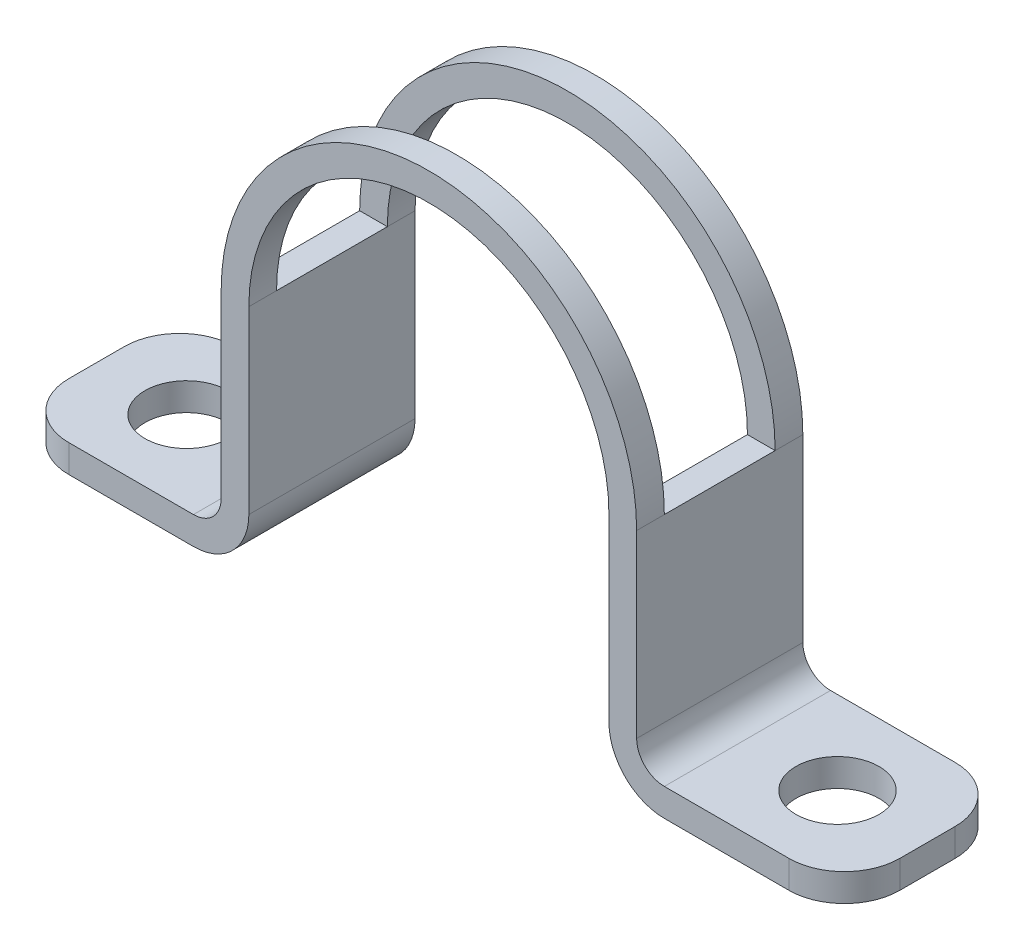
ISO-10303-21;
HEADER;
FILE_DESCRIPTION(('STEP AP214'),'2;1');
FILE_NAME('part.step','',(''),(''),'','','');
FILE_SCHEMA(('AUTOMOTIVE_DESIGN { 1 0 10303 214 1 1 1 1 }'));
ENDSEC;
DATA;
#1=APPLICATION_CONTEXT('core data for automotive mechanical design processes');
#2=APPLICATION_PROTOCOL_DEFINITION('international standard','automotive_design',2000,#1);
#3=PRODUCT_CONTEXT('',#1,'mechanical');
#4=PRODUCT('Part','Part','',(#3));
#5=PRODUCT_RELATED_PRODUCT_CATEGORY('part','',(#4));
#6=PRODUCT_DEFINITION_FORMATION('','',#4);
#7=PRODUCT_DEFINITION_CONTEXT('part definition',#1,'design');
#8=PRODUCT_DEFINITION('design','',#6,#7);
#9=PRODUCT_DEFINITION_SHAPE('','',#8);
#10=(LENGTH_UNIT() NAMED_UNIT(*) SI_UNIT(.MILLI.,.METRE.));
#11=(NAMED_UNIT(*) PLANE_ANGLE_UNIT() SI_UNIT($,.RADIAN.));
#12=(NAMED_UNIT(*) SI_UNIT($,.STERADIAN.) SOLID_ANGLE_UNIT());
#13=UNCERTAINTY_MEASURE_WITH_UNIT(LENGTH_MEASURE(1.E-05),#10,'distance_accuracy_value','');
#14=(GEOMETRIC_REPRESENTATION_CONTEXT(3) GLOBAL_UNCERTAINTY_ASSIGNED_CONTEXT((#13)) GLOBAL_UNIT_ASSIGNED_CONTEXT((#10,
#11,#12)) REPRESENTATION_CONTEXT('',''));
#15=CARTESIAN_POINT('',(0.,0.,0.));
#16=DIRECTION('',(0.,0.,1.));
#17=DIRECTION('',(1.,0.,0.));
#18=AXIS2_PLACEMENT_3D('',#15,#16,#17);
#19=CARTESIAN_POINT('',(7.5,0.,1.));
#20=DIRECTION('',(1.,0.,0.));
#21=DIRECTION('',(0.,1.,0.));
#22=AXIS2_PLACEMENT_3D('',#19,#20,#21);
#23=PLANE('',#22);
#24=DIRECTION('',(0.,-1.,0.));
#25=VECTOR('',#24,1.);
#26=CARTESIAN_POINT('',(7.5,0.,0.));
#27=LINE('',#26,#25);
#28=CARTESIAN_POINT('',(7.5,0.,0.));
#29=VERTEX_POINT('',#28);
#30=CARTESIAN_POINT('',(7.5,-6.5,0.));
#31=VERTEX_POINT('',#30);
#32=EDGE_CURVE('E342',#29,#31,#27,.T.);
#33=ORIENTED_EDGE('',*,*,#32,.F.);
#34=DIRECTION('',(0.,0.,-1.));
#35=VECTOR('',#34,1.);
#36=CARTESIAN_POINT('',(7.5,0.,1.));
#37=LINE('',#36,#35);
#38=CARTESIAN_POINT('',(7.5,0.,1.));
#39=VERTEX_POINT('',#38);
#40=EDGE_CURVE('E377',#39,#29,#37,.T.);
#41=ORIENTED_EDGE('',*,*,#40,.F.);
#42=DIRECTION('',(0.,0.,-1.));
#43=VECTOR('',#42,1.);
#44=CARTESIAN_POINT('',(7.5,0.,5.));
#45=LINE('',#44,#43);
#46=CARTESIAN_POINT('',(7.5,0.,5.));
#47=VERTEX_POINT('',#46);
#48=EDGE_CURVE('E242',#47,#39,#45,.T.);
#49=ORIENTED_EDGE('',*,*,#48,.F.);
#50=DIRECTION('',(0.,0.,1.));
#51=VECTOR('',#50,1.);
#52=CARTESIAN_POINT('',(7.5,0.,5.));
#53=LINE('',#52,#51);
#54=CARTESIAN_POINT('',(7.5,0.,6.));
#55=VERTEX_POINT('',#54);
#56=EDGE_CURVE('E260',#47,#55,#53,.T.);
#57=ORIENTED_EDGE('',*,*,#56,.T.);
#58=DIRECTION('',(0.,-1.,0.));
#59=VECTOR('',#58,1.);
#60=CARTESIAN_POINT('',(7.5,0.,6.));
#61=LINE('',#60,#59);
#62=CARTESIAN_POINT('',(7.5,-6.5,6.));
#63=VERTEX_POINT('',#62);
#64=EDGE_CURVE('E261',#55,#63,#61,.T.);
#65=ORIENTED_EDGE('',*,*,#64,.T.);
#66=DIRECTION('',(0.,0.,-1.));
#67=VECTOR('',#66,1.);
#68=CARTESIAN_POINT('',(7.5,-6.5,1.));
#69=LINE('',#68,#67);
#70=EDGE_CURVE('E348',#63,#31,#69,.T.);
#71=ORIENTED_EDGE('',*,*,#70,.T.);
#72=EDGE_LOOP('',(#33,#41,#49,#57,#65,#71));
#73=FACE_BOUND('',#72,.T.);
#74=ADVANCED_FACE('F34',(#73),#23,.T.);
#75=CARTESIAN_POINT('',(0.,0.,1.));
#76=DIRECTION('',(0.,0.,-1.));
#77=DIRECTION('',(-1.,0.,0.));
#78=AXIS2_PLACEMENT_3D('',#75,#76,#77);
#79=CYLINDRICAL_SURFACE('',#78,7.5);
#80=CARTESIAN_POINT('',(0.,0.,0.));
#81=DIRECTION('',(0.,0.,1.));
#82=DIRECTION('',(1.,0.,0.));
#83=AXIS2_PLACEMENT_3D('',#80,#81,#82);
#84=CIRCLE('',#83,7.5);
#85=CARTESIAN_POINT('',(-7.5,0.,0.));
#86=VERTEX_POINT('',#85);
#87=EDGE_CURVE('E350',#29,#86,#84,.T.);
#88=ORIENTED_EDGE('',*,*,#87,.T.);
#89=DIRECTION('',(0.,0.,-1.));
#90=VECTOR('',#89,1.);
#91=CARTESIAN_POINT('',(-7.5,0.,1.));
#92=LINE('',#91,#90);
#93=CARTESIAN_POINT('',(-7.5,0.,1.));
#94=VERTEX_POINT('',#93);
#95=EDGE_CURVE('E374',#94,#86,#92,.T.);
#96=ORIENTED_EDGE('',*,*,#95,.F.);
#97=CARTESIAN_POINT('',(0.,0.,1.));
#98=DIRECTION('',(0.,0.,1.));
#99=DIRECTION('',(1.,0.,0.));
#100=AXIS2_PLACEMENT_3D('',#97,#98,#99);
#101=CIRCLE('',#100,7.5);
#102=EDGE_CURVE('E343',#39,#94,#101,.T.);
#103=ORIENTED_EDGE('',*,*,#102,.F.);
#104=ORIENTED_EDGE('',*,*,#40,.T.);
#105=EDGE_LOOP('',(#88,#96,#103,#104));
#106=FACE_BOUND('',#105,.T.);
#107=ADVANCED_FACE('F446',(#106),#79,.T.);
#108=CARTESIAN_POINT('',(-7.5,0.,1.));
#109=DIRECTION('',(1.,0.,0.));
#110=DIRECTION('',(0.,0.,-1.));
#111=AXIS2_PLACEMENT_3D('',#108,#109,#110);
#112=PLANE('',#111);
#113=DIRECTION('',(0.,-1.,0.));
#114=VECTOR('',#113,1.);
#115=CARTESIAN_POINT('',(-7.5,0.,0.));
#116=LINE('',#115,#114);
#117=CARTESIAN_POINT('',(-7.5,-6.5,0.));
#118=VERTEX_POINT('',#117);
#119=EDGE_CURVE('E352',#86,#118,#116,.T.);
#120=ORIENTED_EDGE('',*,*,#119,.T.);
#121=DIRECTION('',(0.,0.,-1.));
#122=VECTOR('',#121,1.);
#123=CARTESIAN_POINT('',(-7.5,-6.5,1.));
#124=LINE('',#123,#122);
#125=CARTESIAN_POINT('',(-7.5,-6.5,6.));
#126=VERTEX_POINT('',#125);
#127=EDGE_CURVE('E371',#126,#118,#124,.T.);
#128=ORIENTED_EDGE('',*,*,#127,.F.);
#129=DIRECTION('',(0.,-1.,0.));
#130=VECTOR('',#129,1.);
#131=CARTESIAN_POINT('',(-7.5,0.,6.));
#132=LINE('',#131,#130);
#133=CARTESIAN_POINT('',(-7.5,0.,6.));
#134=VERTEX_POINT('',#133);
#135=EDGE_CURVE('E270',#134,#126,#132,.T.);
#136=ORIENTED_EDGE('',*,*,#135,.F.);
#137=DIRECTION('',(0.,0.,1.));
#138=VECTOR('',#137,1.);
#139=CARTESIAN_POINT('',(-7.5,0.,5.));
#140=LINE('',#139,#138);
#141=CARTESIAN_POINT('',(-7.5,0.,5.));
#142=VERTEX_POINT('',#141);
#143=EDGE_CURVE('E207',#142,#134,#140,.T.);
#144=ORIENTED_EDGE('',*,*,#143,.F.);
#145=DIRECTION('',(0.,0.,1.));
#146=VECTOR('',#145,1.);
#147=CARTESIAN_POINT('',(-7.5,0.,1.));
#148=LINE('',#147,#146);
#149=EDGE_CURVE('E227',#94,#142,#148,.T.);
#150=ORIENTED_EDGE('',*,*,#149,.F.);
#151=ORIENTED_EDGE('',*,*,#95,.T.);
#152=EDGE_LOOP('',(#120,#128,#136,#144,#150,#151));
#153=FACE_BOUND('',#152,.T.);
#154=ADVANCED_FACE('F452',(#153),#112,.F.);
#155=CARTESIAN_POINT('',(-6.5,0.,1.));
#156=DIRECTION('',(1.,0.,0.));
#157=DIRECTION('',(0.,1.,0.));
#158=AXIS2_PLACEMENT_3D('',#155,#156,#157);
#159=PLANE('',#158);
#160=DIRECTION('',(0.,-1.,0.));
#161=VECTOR('',#160,1.);
#162=CARTESIAN_POINT('',(-6.5,0.,0.));
#163=LINE('',#162,#161);
#164=CARTESIAN_POINT('',(-6.5,0.,0.));
#165=VERTEX_POINT('',#164);
#166=CARTESIAN_POINT('',(-6.5,-6.5,0.));
#167=VERTEX_POINT('',#166);
#168=EDGE_CURVE('E354',#165,#167,#163,.T.);
#169=ORIENTED_EDGE('',*,*,#168,.F.);
#170=DIRECTION('',(0.,0.,-1.));
#171=VECTOR('',#170,1.);
#172=CARTESIAN_POINT('',(-6.5,0.,1.));
#173=LINE('',#172,#171);
#174=CARTESIAN_POINT('',(-6.5,0.,1.));
#175=VERTEX_POINT('',#174);
#176=EDGE_CURVE('E232',#175,#165,#173,.T.);
#177=ORIENTED_EDGE('',*,*,#176,.F.);
#178=DIRECTION('',(0.,0.,-1.));
#179=VECTOR('',#178,1.);
#180=CARTESIAN_POINT('',(-6.5,0.,5.));
#181=LINE('',#180,#179);
#182=CARTESIAN_POINT('',(-6.5,0.,5.));
#183=VERTEX_POINT('',#182);
#184=EDGE_CURVE('E225',#183,#175,#181,.T.);
#185=ORIENTED_EDGE('',*,*,#184,.F.);
#186=DIRECTION('',(0.,0.,1.));
#187=VECTOR('',#186,1.);
#188=CARTESIAN_POINT('',(-6.5,0.,5.));
#189=LINE('',#188,#187);
#190=CARTESIAN_POINT('',(-6.5,0.,6.));
#191=VERTEX_POINT('',#190);
#192=EDGE_CURVE('E195',#183,#191,#189,.T.);
#193=ORIENTED_EDGE('',*,*,#192,.T.);
#194=DIRECTION('',(0.,-1.,0.));
#195=VECTOR('',#194,1.);
#196=CARTESIAN_POINT('',(-6.5,0.,6.));
#197=LINE('',#196,#195);
#198=CARTESIAN_POINT('',(-6.5,-6.5,6.));
#199=VERTEX_POINT('',#198);
#200=EDGE_CURVE('E268',#191,#199,#197,.T.);
#201=ORIENTED_EDGE('',*,*,#200,.T.);
#202=DIRECTION('',(0.,0.,-1.));
#203=VECTOR('',#202,1.);
#204=CARTESIAN_POINT('',(-6.5,-6.5,1.));
#205=LINE('',#204,#203);
#206=EDGE_CURVE('E368',#199,#167,#205,.T.);
#207=ORIENTED_EDGE('',*,*,#206,.T.);
#208=EDGE_LOOP('',(#169,#177,#185,#193,#201,#207));
#209=FACE_BOUND('',#208,.T.);
#210=ADVANCED_FACE('F231',(#209),#159,.T.);
#211=CARTESIAN_POINT('',(0.,0.,1.));
#212=DIRECTION('',(0.,0.,-1.));
#213=DIRECTION('',(-1.,0.,0.));
#214=AXIS2_PLACEMENT_3D('',#211,#212,#213);
#215=CYLINDRICAL_SURFACE('',#214,6.5);
#216=CARTESIAN_POINT('',(0.,0.,0.));
#217=DIRECTION('',(0.,0.,1.));
#218=DIRECTION('',(1.,0.,0.));
#219=AXIS2_PLACEMENT_3D('',#216,#217,#218);
#220=CIRCLE('',#219,6.5);
#221=CARTESIAN_POINT('',(6.5,0.,0.));
#222=VERTEX_POINT('',#221);
#223=EDGE_CURVE('E356',#222,#165,#220,.T.);
#224=ORIENTED_EDGE('',*,*,#223,.F.);
#225=DIRECTION('',(0.,0.,-1.));
#226=VECTOR('',#225,1.);
#227=CARTESIAN_POINT('',(6.5,0.,1.));
#228=LINE('',#227,#226);
#229=CARTESIAN_POINT('',(6.5,0.,1.));
#230=VERTEX_POINT('',#229);
#231=EDGE_CURVE('E365',#230,#222,#228,.T.);
#232=ORIENTED_EDGE('',*,*,#231,.F.);
#233=CARTESIAN_POINT('',(0.,0.,1.));
#234=DIRECTION('',(0.,0.,1.));
#235=DIRECTION('',(1.,0.,0.));
#236=AXIS2_PLACEMENT_3D('',#233,#234,#235);
#237=CIRCLE('',#236,6.5);
#238=EDGE_CURVE('E345',#230,#175,#237,.T.);
#239=ORIENTED_EDGE('',*,*,#238,.T.);
#240=ORIENTED_EDGE('',*,*,#176,.T.);
#241=EDGE_LOOP('',(#224,#232,#239,#240));
#242=FACE_BOUND('',#241,.T.);
#243=ADVANCED_FACE('F504',(#242),#215,.F.);
#244=CARTESIAN_POINT('',(6.5,0.,1.));
#245=DIRECTION('',(1.,0.,0.));
#246=DIRECTION('',(0.,1.,0.));
#247=AXIS2_PLACEMENT_3D('',#244,#245,#246);
#248=PLANE('',#247);
#249=DIRECTION('',(0.,-1.,0.));
#250=VECTOR('',#249,1.);
#251=CARTESIAN_POINT('',(6.5,0.,0.));
#252=LINE('',#251,#250);
#253=CARTESIAN_POINT('',(6.5,-6.5,0.));
#254=VERTEX_POINT('',#253);
#255=EDGE_CURVE('E346',#222,#254,#252,.T.);
#256=ORIENTED_EDGE('',*,*,#255,.T.);
#257=DIRECTION('',(0.,0.,-1.));
#258=VECTOR('',#257,1.);
#259=CARTESIAN_POINT('',(6.5,-6.5,1.));
#260=LINE('',#259,#258);
#261=CARTESIAN_POINT('',(6.5,-6.5,6.));
#262=VERTEX_POINT('',#261);
#263=EDGE_CURVE('E362',#262,#254,#260,.T.);
#264=ORIENTED_EDGE('',*,*,#263,.F.);
#265=DIRECTION('',(0.,-1.,0.));
#266=VECTOR('',#265,1.);
#267=CARTESIAN_POINT('',(6.5,0.,6.));
#268=LINE('',#267,#266);
#269=CARTESIAN_POINT('',(6.5,0.,6.));
#270=VERTEX_POINT('',#269);
#271=EDGE_CURVE('E264',#270,#262,#268,.T.);
#272=ORIENTED_EDGE('',*,*,#271,.F.);
#273=DIRECTION('',(0.,0.,1.));
#274=VECTOR('',#273,1.);
#275=CARTESIAN_POINT('',(6.5,0.,5.));
#276=LINE('',#275,#274);
#277=CARTESIAN_POINT('',(6.5,0.,5.));
#278=VERTEX_POINT('',#277);
#279=EDGE_CURVE('E206',#278,#270,#276,.T.);
#280=ORIENTED_EDGE('',*,*,#279,.F.);
#281=DIRECTION('',(0.,0.,1.));
#282=VECTOR('',#281,1.);
#283=CARTESIAN_POINT('',(6.5,0.,1.));
#284=LINE('',#283,#282);
#285=EDGE_CURVE('E236',#230,#278,#284,.T.);
#286=ORIENTED_EDGE('',*,*,#285,.F.);
#287=ORIENTED_EDGE('',*,*,#231,.T.);
#288=EDGE_LOOP('',(#256,#264,#272,#280,#286,#287));
#289=FACE_BOUND('',#288,.T.);
#290=ADVANCED_FACE('F500',(#289),#248,.F.);
#291=CARTESIAN_POINT('',(0.,0.,1.));
#292=DIRECTION('',(0.,0.,1.));
#293=DIRECTION('',(1.,0.,0.));
#294=AXIS2_PLACEMENT_3D('',#291,#292,#293);
#295=PLANE('',#294);
#296=DIRECTION('',(-1.,0.,0.));
#297=VECTOR('',#296,1.);
#298=CARTESIAN_POINT('',(-6.5,0.,1.));
#299=LINE('',#298,#297);
#300=EDGE_CURVE('E234',#175,#94,#299,.T.);
#301=ORIENTED_EDGE('',*,*,#300,.F.);
#302=ORIENTED_EDGE('',*,*,#238,.F.);
#303=DIRECTION('',(-1.,0.,0.));
#304=VECTOR('',#303,1.);
#305=CARTESIAN_POINT('',(7.5,0.,1.));
#306=LINE('',#305,#304);
#307=EDGE_CURVE('E245',#39,#230,#306,.T.);
#308=ORIENTED_EDGE('',*,*,#307,.F.);
#309=ORIENTED_EDGE('',*,*,#102,.T.);
#310=EDGE_LOOP('',(#301,#302,#308,#309));
#311=FACE_BOUND('',#310,.T.);
#312=ADVANCED_FACE('F506',(#311),#295,.T.);
#313=CARTESIAN_POINT('',(0.,0.,0.));
#314=DIRECTION('',(0.,0.,1.));
#315=DIRECTION('',(1.,0.,0.));
#316=AXIS2_PLACEMENT_3D('',#313,#314,#315);
#317=PLANE('',#316);
#318=DIRECTION('',(1.,0.,0.));
#319=VECTOR('',#318,1.);
#320=CARTESIAN_POINT('',(0.,-7.49999999999999,0.));
#321=LINE('',#320,#319);
#322=CARTESIAN_POINT('',(8.5,-7.5,0.));
#323=VERTEX_POINT('',#322);
#324=CARTESIAN_POINT('',(13.,-7.50000000000001,0.));
#325=VERTEX_POINT('',#324);
#326=EDGE_CURVE('E296',#323,#325,#321,.T.);
#327=ORIENTED_EDGE('',*,*,#326,.T.);
#328=DIRECTION('',(0.,-1.,0.));
#329=VECTOR('',#328,1.);
#330=CARTESIAN_POINT('',(13.,-8.50000000000001,0.));
#331=LINE('',#330,#329);
#332=CARTESIAN_POINT('',(13.,-8.50000000000001,0.));
#333=VERTEX_POINT('',#332);
#334=EDGE_CURVE('E383',#325,#333,#331,.T.);
#335=ORIENTED_EDGE('',*,*,#334,.T.);
#336=DIRECTION('',(1.,0.,0.));
#337=VECTOR('',#336,1.);
#338=CARTESIAN_POINT('',(0.,-8.49999999999999,0.));
#339=LINE('',#338,#337);
#340=CARTESIAN_POINT('',(8.5,-8.5,0.));
#341=VERTEX_POINT('',#340);
#342=EDGE_CURVE('E293',#341,#333,#339,.T.);
#343=ORIENTED_EDGE('',*,*,#342,.F.);
#344=CARTESIAN_POINT('',(8.5,-6.5,0.));
#345=DIRECTION('',(0.,0.,1.));
#346=DIRECTION('',(1.,0.,0.));
#347=AXIS2_PLACEMENT_3D('',#344,#345,#346);
#348=CIRCLE('',#347,2.);
#349=EDGE_CURVE('E278',#254,#341,#348,.T.);
#350=ORIENTED_EDGE('',*,*,#349,.F.);
#351=ORIENTED_EDGE('',*,*,#255,.F.);
#352=ORIENTED_EDGE('',*,*,#223,.T.);
#353=ORIENTED_EDGE('',*,*,#168,.T.);
#354=CARTESIAN_POINT('',(-8.5,-6.5,0.));
#355=DIRECTION('',(0.,0.,1.));
#356=DIRECTION('',(1.,0.,0.));
#357=AXIS2_PLACEMENT_3D('',#354,#355,#356);
#358=CIRCLE('',#357,2.);
#359=CARTESIAN_POINT('',(-8.5,-8.5,0.));
#360=VERTEX_POINT('',#359);
#361=EDGE_CURVE('E315',#167,#360,#358,.F.);
#362=ORIENTED_EDGE('',*,*,#361,.T.);
#363=DIRECTION('',(-1.,0.,0.));
#364=VECTOR('',#363,1.);
#365=CARTESIAN_POINT('',(0.,-8.5,0.));
#366=LINE('',#365,#364);
#367=CARTESIAN_POINT('',(-13.,-8.5,0.));
#368=VERTEX_POINT('',#367);
#369=EDGE_CURVE('E328',#360,#368,#366,.T.);
#370=ORIENTED_EDGE('',*,*,#369,.T.);
#371=DIRECTION('',(0.,-1.,0.));
#372=VECTOR('',#371,1.);
#373=CARTESIAN_POINT('',(-13.,0.,0.));
#374=LINE('',#373,#372);
#375=CARTESIAN_POINT('',(-13.,-7.5,0.));
#376=VERTEX_POINT('',#375);
#377=EDGE_CURVE('E379',#368,#376,#374,.F.);
#378=ORIENTED_EDGE('',*,*,#377,.T.);
#379=DIRECTION('',(-1.,0.,0.));
#380=VECTOR('',#379,1.);
#381=CARTESIAN_POINT('',(0.,-7.5,0.));
#382=LINE('',#381,#380);
#383=CARTESIAN_POINT('',(-8.5,-7.5,0.));
#384=VERTEX_POINT('',#383);
#385=EDGE_CURVE('E326',#384,#376,#382,.T.);
#386=ORIENTED_EDGE('',*,*,#385,.F.);
#387=CARTESIAN_POINT('',(-8.5,-6.5,0.));
#388=DIRECTION('',(0.,0.,1.));
#389=DIRECTION('',(1.,0.,0.));
#390=AXIS2_PLACEMENT_3D('',#387,#388,#389);
#391=CIRCLE('',#390,1.);
#392=EDGE_CURVE('E311',#118,#384,#391,.F.);
#393=ORIENTED_EDGE('',*,*,#392,.F.);
#394=ORIENTED_EDGE('',*,*,#119,.F.);
#395=ORIENTED_EDGE('',*,*,#87,.F.);
#396=ORIENTED_EDGE('',*,*,#32,.T.);
#397=CARTESIAN_POINT('',(8.5,-6.5,0.));
#398=DIRECTION('',(0.,0.,1.));
#399=DIRECTION('',(1.,0.,0.));
#400=AXIS2_PLACEMENT_3D('',#397,#398,#399);
#401=CIRCLE('',#400,0.999999999999999);
#402=EDGE_CURVE('E282',#31,#323,#401,.T.);
#403=ORIENTED_EDGE('',*,*,#402,.T.);
#404=EDGE_LOOP('',(#327,#335,#343,#350,#351,#352,#353,#362,#370,#378,#386,#393,#394,#395,#396,#403));
#405=FACE_BOUND('',#404,.T.);
#406=ADVANCED_FACE('F433',(#405),#317,.F.);
#407=CARTESIAN_POINT('',(-8.5,-6.5,6.));
#408=DIRECTION('',(0.,0.,-1.));
#409=DIRECTION('',(-1.,0.,0.));
#410=AXIS2_PLACEMENT_3D('',#407,#408,#409);
#411=CYLINDRICAL_SURFACE('',#410,1.);
#412=ORIENTED_EDGE('',*,*,#392,.T.);
#413=DIRECTION('',(0.,0.,-1.));
#414=VECTOR('',#413,1.);
#415=CARTESIAN_POINT('',(-8.5,-7.5,6.));
#416=LINE('',#415,#414);
#417=CARTESIAN_POINT('',(-8.5,-7.5,6.));
#418=VERTEX_POINT('',#417);
#419=EDGE_CURVE('E339',#418,#384,#416,.T.);
#420=ORIENTED_EDGE('',*,*,#419,.F.);
#421=CARTESIAN_POINT('',(-8.5,-6.5,6.));
#422=DIRECTION('',(0.,0.,1.));
#423=DIRECTION('',(1.,0.,0.));
#424=AXIS2_PLACEMENT_3D('',#421,#422,#423);
#425=CIRCLE('',#424,1.);
#426=EDGE_CURVE('E312',#126,#418,#425,.F.);
#427=ORIENTED_EDGE('',*,*,#426,.F.);
#428=ORIENTED_EDGE('',*,*,#127,.T.);
#429=EDGE_LOOP('',(#412,#420,#427,#428));
#430=FACE_BOUND('',#429,.T.);
#431=ADVANCED_FACE('F553',(#430),#411,.F.);
#432=CARTESIAN_POINT('',(0.,-7.5,6.));
#433=DIRECTION('',(0.,-1.,0.));
#434=DIRECTION('',(1.,0.,0.));
#435=AXIS2_PLACEMENT_3D('',#432,#433,#434);
#436=PLANE('',#435);
#437=CARTESIAN_POINT('',(-11.75,-7.5,3.));
#438=DIRECTION('',(0.,1.,0.));
#439=DIRECTION('',(-1.,0.,0.));
#440=AXIS2_PLACEMENT_3D('',#437,#438,#439);
#441=CIRCLE('',#440,1.5);
#442=CARTESIAN_POINT('',(-13.25,-7.5,3.));
#443=VERTEX_POINT('',#442);
#444=EDGE_CURVE('E254',#443,#443,#441,.T.);
#445=ORIENTED_EDGE('',*,*,#444,.F.);
#446=EDGE_LOOP('',(#445));
#447=FACE_BOUND('',#446,.T.);
#448=DIRECTION('',(0.,0.,-1.));
#449=VECTOR('',#448,1.);
#450=CARTESIAN_POINT('',(-15.,-7.5,6.));
#451=LINE('',#450,#449);
#452=CARTESIAN_POINT('',(-15.,-7.5,4.));
#453=VERTEX_POINT('',#452);
#454=CARTESIAN_POINT('',(-15.,-7.5,2.));
#455=VERTEX_POINT('',#454);
#456=EDGE_CURVE('E337',#453,#455,#451,.T.);
#457=ORIENTED_EDGE('',*,*,#456,.F.);
#458=CARTESIAN_POINT('',(-13.,-7.5,4.));
#459=DIRECTION('',(0.,-1.,0.));
#460=DIRECTION('',(1.,0.,0.));
#461=AXIS2_PLACEMENT_3D('',#458,#459,#460);
#462=CIRCLE('',#461,2.);
#463=CARTESIAN_POINT('',(-13.,-7.5,6.));
#464=VERTEX_POINT('',#463);
#465=EDGE_CURVE('E11',#453,#464,#462,.F.);
#466=ORIENTED_EDGE('',*,*,#465,.T.);
#467=DIRECTION('',(-1.,0.,0.));
#468=VECTOR('',#467,1.);
#469=CARTESIAN_POINT('',(0.,-7.5,6.));
#470=LINE('',#469,#468);
#471=EDGE_CURVE('E314',#418,#464,#470,.T.);
#472=ORIENTED_EDGE('',*,*,#471,.F.);
#473=ORIENTED_EDGE('',*,*,#419,.T.);
#474=ORIENTED_EDGE('',*,*,#385,.T.);
#475=CARTESIAN_POINT('',(-13.,-7.5,2.));
#476=DIRECTION('',(0.,-1.,0.));
#477=DIRECTION('',(1.,0.,0.));
#478=AXIS2_PLACEMENT_3D('',#475,#476,#477);
#479=CIRCLE('',#478,2.);
#480=EDGE_CURVE('E42',#376,#455,#479,.F.);
#481=ORIENTED_EDGE('',*,*,#480,.T.);
#482=EDGE_LOOP('',(#457,#466,#472,#473,#474,#481));
#483=FACE_BOUND('',#482,.T.);
#484=ADVANCED_FACE('F428',(#447,#483),#436,.F.);
#485=CARTESIAN_POINT('',(-15.,0.,6.));
#486=DIRECTION('',(1.,0.,0.));
#487=DIRECTION('',(0.,0.,-1.));
#488=AXIS2_PLACEMENT_3D('',#485,#486,#487);
#489=PLANE('',#488);
#490=DIRECTION('',(0.,0.,-1.));
#491=VECTOR('',#490,1.);
#492=CARTESIAN_POINT('',(-15.,-8.5,6.));
#493=LINE('',#492,#491);
#494=CARTESIAN_POINT('',(-15.,-8.5,4.));
#495=VERTEX_POINT('',#494);
#496=CARTESIAN_POINT('',(-15.,-8.5,2.));
#497=VERTEX_POINT('',#496);
#498=EDGE_CURVE('E334',#495,#497,#493,.T.);
#499=ORIENTED_EDGE('',*,*,#498,.F.);
#500=DIRECTION('',(0.,-1.,0.));
#501=VECTOR('',#500,1.);
#502=CARTESIAN_POINT('',(-15.,-7.5,4.));
#503=LINE('',#502,#501);
#504=EDGE_CURVE('E55',#495,#453,#503,.F.);
#505=ORIENTED_EDGE('',*,*,#504,.T.);
#506=ORIENTED_EDGE('',*,*,#456,.T.);
#507=DIRECTION('',(0.,-1.,0.));
#508=VECTOR('',#507,1.);
#509=CARTESIAN_POINT('',(-15.,0.,2.));
#510=LINE('',#509,#508);
#511=EDGE_CURVE('E408',#455,#497,#510,.T.);
#512=ORIENTED_EDGE('',*,*,#511,.T.);
#513=EDGE_LOOP('',(#499,#505,#506,#512));
#514=FACE_BOUND('',#513,.T.);
#515=ADVANCED_FACE('F412',(#514),#489,.F.);
#516=CARTESIAN_POINT('',(0.,-8.5,6.));
#517=DIRECTION('',(0.,-1.,0.));
#518=DIRECTION('',(0.,0.,-1.));
#519=AXIS2_PLACEMENT_3D('',#516,#517,#518);
#520=PLANE('',#519);
#521=CARTESIAN_POINT('',(-11.75,-8.5,3.));
#522=DIRECTION('',(0.,-1.,0.));
#523=DIRECTION('',(0.,0.,-1.));
#524=AXIS2_PLACEMENT_3D('',#521,#522,#523);
#525=CIRCLE('',#524,1.5);
#526=CARTESIAN_POINT('',(-11.75,-8.5,1.5));
#527=VERTEX_POINT('',#526);
#528=EDGE_CURVE('E256',#527,#527,#525,.T.);
#529=ORIENTED_EDGE('',*,*,#528,.F.);
#530=EDGE_LOOP('',(#529));
#531=FACE_BOUND('',#530,.T.);
#532=DIRECTION('',(-1.,0.,0.));
#533=VECTOR('',#532,1.);
#534=CARTESIAN_POINT('',(0.,-8.5,6.));
#535=LINE('',#534,#533);
#536=CARTESIAN_POINT('',(-8.5,-8.5,6.));
#537=VERTEX_POINT('',#536);
#538=CARTESIAN_POINT('',(-13.,-8.5,6.));
#539=VERTEX_POINT('',#538);
#540=EDGE_CURVE('E318',#537,#539,#535,.T.);
#541=ORIENTED_EDGE('',*,*,#540,.T.);
#542=CARTESIAN_POINT('',(-13.,-8.5,4.));
#543=DIRECTION('',(0.,-1.,0.));
#544=DIRECTION('',(0.,0.,-1.));
#545=AXIS2_PLACEMENT_3D('',#542,#543,#544);
#546=CIRCLE('',#545,2.);
#547=EDGE_CURVE('E406',#539,#495,#546,.T.);
#548=ORIENTED_EDGE('',*,*,#547,.T.);
#549=ORIENTED_EDGE('',*,*,#498,.T.);
#550=CARTESIAN_POINT('',(-13.,-8.5,2.));
#551=DIRECTION('',(0.,-1.,0.));
#552=DIRECTION('',(0.,0.,-1.));
#553=AXIS2_PLACEMENT_3D('',#550,#551,#552);
#554=CIRCLE('',#553,2.);
#555=EDGE_CURVE('E404',#497,#368,#554,.T.);
#556=ORIENTED_EDGE('',*,*,#555,.T.);
#557=ORIENTED_EDGE('',*,*,#369,.F.);
#558=DIRECTION('',(0.,0.,-1.));
#559=VECTOR('',#558,1.);
#560=CARTESIAN_POINT('',(-8.5,-8.5,6.));
#561=LINE('',#560,#559);
#562=EDGE_CURVE('E324',#537,#360,#561,.T.);
#563=ORIENTED_EDGE('',*,*,#562,.F.);
#564=EDGE_LOOP('',(#541,#548,#549,#556,#557,#563));
#565=FACE_BOUND('',#564,.T.);
#566=ADVANCED_FACE('F415',(#531,#565),#520,.T.);
#567=CARTESIAN_POINT('',(-8.5,-6.5,6.));
#568=DIRECTION('',(0.,0.,-1.));
#569=DIRECTION('',(-1.,0.,0.));
#570=AXIS2_PLACEMENT_3D('',#567,#568,#569);
#571=CYLINDRICAL_SURFACE('',#570,2.);
#572=ORIENTED_EDGE('',*,*,#361,.F.);
#573=ORIENTED_EDGE('',*,*,#206,.F.);
#574=CARTESIAN_POINT('',(-8.5,-6.5,6.));
#575=DIRECTION('',(0.,0.,1.));
#576=DIRECTION('',(1.,0.,0.));
#577=AXIS2_PLACEMENT_3D('',#574,#575,#576);
#578=CIRCLE('',#577,2.);
#579=EDGE_CURVE('E321',#199,#537,#578,.F.);
#580=ORIENTED_EDGE('',*,*,#579,.T.);
#581=ORIENTED_EDGE('',*,*,#562,.T.);
#582=EDGE_LOOP('',(#572,#573,#580,#581));
#583=FACE_BOUND('',#582,.T.);
#584=ADVANCED_FACE('F542',(#583),#571,.T.);
#585=CARTESIAN_POINT('',(0.,0.,6.));
#586=DIRECTION('',(0.,0.,1.));
#587=DIRECTION('',(1.,0.,0.));
#588=AXIS2_PLACEMENT_3D('',#585,#586,#587);
#589=PLANE('',#588);
#590=DIRECTION('',(1.,0.,0.));
#591=VECTOR('',#590,1.);
#592=CARTESIAN_POINT('',(0.,-8.49999999999999,6.));
#593=LINE('',#592,#591);
#594=CARTESIAN_POINT('',(8.5,-8.5,6.));
#595=VERTEX_POINT('',#594);
#596=CARTESIAN_POINT('',(13.,-8.50000000000001,6.));
#597=VERTEX_POINT('',#596);
#598=EDGE_CURVE('E281',#595,#597,#593,.T.);
#599=ORIENTED_EDGE('',*,*,#598,.T.);
#600=DIRECTION('',(0.,-1.,0.));
#601=VECTOR('',#600,1.);
#602=CARTESIAN_POINT('',(13.,0.,6.));
#603=LINE('',#602,#601);
#604=CARTESIAN_POINT('',(13.,-7.50000000000001,6.));
#605=VERTEX_POINT('',#604);
#606=EDGE_CURVE('E402',#597,#605,#603,.F.);
#607=ORIENTED_EDGE('',*,*,#606,.T.);
#608=DIRECTION('',(1.,0.,0.));
#609=VECTOR('',#608,1.);
#610=CARTESIAN_POINT('',(0.,-7.49999999999999,6.));
#611=LINE('',#610,#609);
#612=CARTESIAN_POINT('',(8.5,-7.5,6.));
#613=VERTEX_POINT('',#612);
#614=EDGE_CURVE('E285',#613,#605,#611,.T.);
#615=ORIENTED_EDGE('',*,*,#614,.F.);
#616=CARTESIAN_POINT('',(8.5,-6.5,6.));
#617=DIRECTION('',(0.,0.,1.));
#618=DIRECTION('',(1.,0.,0.));
#619=AXIS2_PLACEMENT_3D('',#616,#617,#618);
#620=CIRCLE('',#619,0.999999999999999);
#621=EDGE_CURVE('E288',#63,#613,#620,.T.);
#622=ORIENTED_EDGE('',*,*,#621,.F.);
#623=ORIENTED_EDGE('',*,*,#64,.F.);
#624=CARTESIAN_POINT('',(0.,0.,6.));
#625=DIRECTION('',(0.,0.,1.));
#626=DIRECTION('',(1.,0.,0.));
#627=AXIS2_PLACEMENT_3D('',#624,#625,#626);
#628=CIRCLE('',#627,7.5);
#629=EDGE_CURVE('E218',#55,#134,#628,.T.);
#630=ORIENTED_EDGE('',*,*,#629,.T.);
#631=ORIENTED_EDGE('',*,*,#135,.T.);
#632=ORIENTED_EDGE('',*,*,#426,.T.);
#633=ORIENTED_EDGE('',*,*,#471,.T.);
#634=DIRECTION('',(0.,-1.,0.));
#635=VECTOR('',#634,1.);
#636=CARTESIAN_POINT('',(-13.,-8.5,6.));
#637=LINE('',#636,#635);
#638=EDGE_CURVE('E399',#464,#539,#637,.T.);
#639=ORIENTED_EDGE('',*,*,#638,.T.);
#640=ORIENTED_EDGE('',*,*,#540,.F.);
#641=ORIENTED_EDGE('',*,*,#579,.F.);
#642=ORIENTED_EDGE('',*,*,#200,.F.);
#643=CARTESIAN_POINT('',(0.,0.,6.));
#644=DIRECTION('',(0.,0.,1.));
#645=DIRECTION('',(1.,0.,0.));
#646=AXIS2_PLACEMENT_3D('',#643,#644,#645);
#647=CIRCLE('',#646,6.5);
#648=EDGE_CURVE('E201',#270,#191,#647,.T.);
#649=ORIENTED_EDGE('',*,*,#648,.F.);
#650=ORIENTED_EDGE('',*,*,#271,.T.);
#651=CARTESIAN_POINT('',(8.5,-6.5,6.));
#652=DIRECTION('',(0.,0.,1.));
#653=DIRECTION('',(1.,0.,0.));
#654=AXIS2_PLACEMENT_3D('',#651,#652,#653);
#655=CIRCLE('',#654,2.);
#656=EDGE_CURVE('E279',#262,#595,#655,.T.);
#657=ORIENTED_EDGE('',*,*,#656,.T.);
#658=EDGE_LOOP('',(#599,#607,#615,#622,#623,#630,#631,#632,#633,#639,#640,#641,#642,#649,#650,#657));
#659=FACE_BOUND('',#658,.T.);
#660=ADVANCED_FACE('F423',(#659),#589,.T.);
#661=CARTESIAN_POINT('',(8.5,-6.5,6.));
#662=DIRECTION('',(0.,0.,-1.));
#663=DIRECTION('',(-1.,0.,0.));
#664=AXIS2_PLACEMENT_3D('',#661,#662,#663);
#665=CYLINDRICAL_SURFACE('',#664,2.);
#666=ORIENTED_EDGE('',*,*,#349,.T.);
#667=DIRECTION('',(0.,0.,-1.));
#668=VECTOR('',#667,1.);
#669=CARTESIAN_POINT('',(8.5,-8.5,6.));
#670=LINE('',#669,#668);
#671=EDGE_CURVE('E308',#595,#341,#670,.T.);
#672=ORIENTED_EDGE('',*,*,#671,.F.);
#673=ORIENTED_EDGE('',*,*,#656,.F.);
#674=ORIENTED_EDGE('',*,*,#263,.T.);
#675=EDGE_LOOP('',(#666,#672,#673,#674));
#676=FACE_BOUND('',#675,.T.);
#677=ADVANCED_FACE('F497',(#676),#665,.T.);
#678=CARTESIAN_POINT('',(0.,-8.49999999999999,6.));
#679=DIRECTION('',(0.,1.,0.));
#680=DIRECTION('',(-1.,0.,0.));
#681=AXIS2_PLACEMENT_3D('',#678,#679,#680);
#682=PLANE('',#681);
#683=CARTESIAN_POINT('',(11.75,-8.5,3.));
#684=DIRECTION('',(0.,1.,0.));
#685=DIRECTION('',(-1.,0.,0.));
#686=AXIS2_PLACEMENT_3D('',#683,#684,#685);
#687=CIRCLE('',#686,1.5);
#688=CARTESIAN_POINT('',(10.25,-8.5,3.));
#689=VERTEX_POINT('',#688);
#690=EDGE_CURVE('E251',#689,#689,#687,.F.);
#691=ORIENTED_EDGE('',*,*,#690,.F.);
#692=EDGE_LOOP('',(#691));
#693=FACE_BOUND('',#692,.T.);
#694=ORIENTED_EDGE('',*,*,#342,.T.);
#695=CARTESIAN_POINT('',(13.,-8.50000000000001,2.));
#696=DIRECTION('',(0.,1.,0.));
#697=DIRECTION('',(-1.,0.,0.));
#698=AXIS2_PLACEMENT_3D('',#695,#696,#697);
#699=CIRCLE('',#698,2.);
#700=CARTESIAN_POINT('',(15.,-8.50000000000001,2.));
#701=VERTEX_POINT('',#700);
#702=EDGE_CURVE('E388',#333,#701,#699,.F.);
#703=ORIENTED_EDGE('',*,*,#702,.T.);
#704=DIRECTION('',(0.,0.,-1.));
#705=VECTOR('',#704,1.);
#706=CARTESIAN_POINT('',(15.,-8.50000000000001,6.));
#707=LINE('',#706,#705);
#708=CARTESIAN_POINT('',(15.,-8.50000000000001,4.));
#709=VERTEX_POINT('',#708);
#710=EDGE_CURVE('E305',#709,#701,#707,.T.);
#711=ORIENTED_EDGE('',*,*,#710,.F.);
#712=CARTESIAN_POINT('',(13.,-8.50000000000001,4.));
#713=DIRECTION('',(0.,1.,0.));
#714=DIRECTION('',(-1.,0.,0.));
#715=AXIS2_PLACEMENT_3D('',#712,#713,#714);
#716=CIRCLE('',#715,2.);
#717=EDGE_CURVE('E386',#709,#597,#716,.F.);
#718=ORIENTED_EDGE('',*,*,#717,.T.);
#719=ORIENTED_EDGE('',*,*,#598,.F.);
#720=ORIENTED_EDGE('',*,*,#671,.T.);
#721=EDGE_LOOP('',(#694,#703,#711,#718,#719,#720));
#722=FACE_BOUND('',#721,.T.);
#723=ADVANCED_FACE('F492',(#693,#722),#682,.F.);
#724=CARTESIAN_POINT('',(15.,0.,6.));
#725=DIRECTION('',(1.,0.,0.));
#726=DIRECTION('',(0.,0.,-1.));
#727=AXIS2_PLACEMENT_3D('',#724,#725,#726);
#728=PLANE('',#727);
#729=ORIENTED_EDGE('',*,*,#710,.T.);
#730=DIRECTION('',(0.,-1.,0.));
#731=VECTOR('',#730,1.);
#732=CARTESIAN_POINT('',(15.,-7.50000000000001,2.));
#733=LINE('',#732,#731);
#734=CARTESIAN_POINT('',(15.,-7.50000000000001,2.));
#735=VERTEX_POINT('',#734);
#736=EDGE_CURVE('E393',#701,#735,#733,.F.);
#737=ORIENTED_EDGE('',*,*,#736,.T.);
#738=DIRECTION('',(0.,0.,-1.));
#739=VECTOR('',#738,1.);
#740=CARTESIAN_POINT('',(15.,-7.50000000000001,6.));
#741=LINE('',#740,#739);
#742=CARTESIAN_POINT('',(15.,-7.50000000000001,4.));
#743=VERTEX_POINT('',#742);
#744=EDGE_CURVE('E302',#743,#735,#741,.T.);
#745=ORIENTED_EDGE('',*,*,#744,.F.);
#746=DIRECTION('',(0.,-1.,0.));
#747=VECTOR('',#746,1.);
#748=CARTESIAN_POINT('',(15.,0.,4.));
#749=LINE('',#748,#747);
#750=EDGE_CURVE('E390',#743,#709,#749,.T.);
#751=ORIENTED_EDGE('',*,*,#750,.T.);
#752=EDGE_LOOP('',(#729,#737,#745,#751));
#753=FACE_BOUND('',#752,.T.);
#754=ADVANCED_FACE('F476',(#753),#728,.T.);
#755=CARTESIAN_POINT('',(0.,-7.49999999999999,6.));
#756=DIRECTION('',(0.,1.,0.));
#757=DIRECTION('',(-1.,0.,0.));
#758=AXIS2_PLACEMENT_3D('',#755,#756,#757);
#759=PLANE('',#758);
#760=CARTESIAN_POINT('',(11.75,-7.5,3.));
#761=DIRECTION('',(0.,-1.,0.));
#762=DIRECTION('',(1.,0.,0.));
#763=AXIS2_PLACEMENT_3D('',#760,#761,#762);
#764=CIRCLE('',#763,1.5);
#765=CARTESIAN_POINT('',(13.25,-7.5,3.));
#766=VERTEX_POINT('',#765);
#767=EDGE_CURVE('E248',#766,#766,#764,.T.);
#768=ORIENTED_EDGE('',*,*,#767,.T.);
#769=EDGE_LOOP('',(#768));
#770=FACE_BOUND('',#769,.T.);
#771=ORIENTED_EDGE('',*,*,#744,.T.);
#772=CARTESIAN_POINT('',(13.,-7.50000000000001,2.));
#773=DIRECTION('',(0.,1.,0.));
#774=DIRECTION('',(-1.,0.,0.));
#775=AXIS2_PLACEMENT_3D('',#772,#773,#774);
#776=CIRCLE('',#775,2.);
#777=EDGE_CURVE('E397',#735,#325,#776,.T.);
#778=ORIENTED_EDGE('',*,*,#777,.T.);
#779=ORIENTED_EDGE('',*,*,#326,.F.);
#780=DIRECTION('',(0.,0.,-1.));
#781=VECTOR('',#780,1.);
#782=CARTESIAN_POINT('',(8.5,-7.5,6.));
#783=LINE('',#782,#781);
#784=EDGE_CURVE('E291',#613,#323,#783,.T.);
#785=ORIENTED_EDGE('',*,*,#784,.F.);
#786=ORIENTED_EDGE('',*,*,#614,.T.);
#787=CARTESIAN_POINT('',(13.,-7.50000000000001,4.));
#788=DIRECTION('',(0.,1.,0.));
#789=DIRECTION('',(-1.,0.,0.));
#790=AXIS2_PLACEMENT_3D('',#787,#788,#789);
#791=CIRCLE('',#790,2.);
#792=EDGE_CURVE('E395',#605,#743,#791,.T.);
#793=ORIENTED_EDGE('',*,*,#792,.T.);
#794=EDGE_LOOP('',(#771,#778,#779,#785,#786,#793));
#795=FACE_BOUND('',#794,.T.);
#796=ADVANCED_FACE('F472',(#770,#795),#759,.T.);
#797=CARTESIAN_POINT('',(8.5,-6.5,6.));
#798=DIRECTION('',(0.,0.,-1.));
#799=DIRECTION('',(-1.,0.,0.));
#800=AXIS2_PLACEMENT_3D('',#797,#798,#799);
#801=CYLINDRICAL_SURFACE('',#800,0.999999999999999);
#802=ORIENTED_EDGE('',*,*,#402,.F.);
#803=ORIENTED_EDGE('',*,*,#70,.F.);
#804=ORIENTED_EDGE('',*,*,#621,.T.);
#805=ORIENTED_EDGE('',*,*,#784,.T.);
#806=EDGE_LOOP('',(#802,#803,#804,#805));
#807=FACE_BOUND('',#806,.T.);
#808=ADVANCED_FACE('F485',(#807),#801,.F.);
#809=CARTESIAN_POINT('',(0.,0.,5.));
#810=DIRECTION('',(0.,0.,1.));
#811=DIRECTION('',(1.,0.,0.));
#812=AXIS2_PLACEMENT_3D('',#809,#810,#811);
#813=CYLINDRICAL_SURFACE('',#812,6.5);
#814=ORIENTED_EDGE('',*,*,#648,.T.);
#815=ORIENTED_EDGE('',*,*,#192,.F.);
#816=CARTESIAN_POINT('',(0.,0.,5.));
#817=DIRECTION('',(0.,0.,1.));
#818=DIRECTION('',(1.,0.,0.));
#819=AXIS2_PLACEMENT_3D('',#816,#817,#818);
#820=CIRCLE('',#819,6.5);
#821=EDGE_CURVE('E198',#278,#183,#820,.T.);
#822=ORIENTED_EDGE('',*,*,#821,.F.);
#823=ORIENTED_EDGE('',*,*,#279,.T.);
#824=EDGE_LOOP('',(#814,#815,#822,#823));
#825=FACE_BOUND('',#824,.T.);
#826=ADVANCED_FACE('F197',(#825),#813,.F.);
#827=CARTESIAN_POINT('',(0.,0.,5.));
#828=DIRECTION('',(0.,0.,1.));
#829=DIRECTION('',(1.,0.,0.));
#830=AXIS2_PLACEMENT_3D('',#827,#828,#829);
#831=CYLINDRICAL_SURFACE('',#830,7.5);
#832=ORIENTED_EDGE('',*,*,#629,.F.);
#833=ORIENTED_EDGE('',*,*,#56,.F.);
#834=CARTESIAN_POINT('',(0.,0.,5.));
#835=DIRECTION('',(0.,0.,1.));
#836=DIRECTION('',(1.,0.,0.));
#837=AXIS2_PLACEMENT_3D('',#834,#835,#836);
#838=CIRCLE('',#837,7.5);
#839=EDGE_CURVE('E217',#47,#142,#838,.T.);
#840=ORIENTED_EDGE('',*,*,#839,.T.);
#841=ORIENTED_EDGE('',*,*,#143,.T.);
#842=EDGE_LOOP('',(#832,#833,#840,#841));
#843=FACE_BOUND('',#842,.T.);
#844=ADVANCED_FACE('F516',(#843),#831,.T.);
#845=CARTESIAN_POINT('',(0.,0.,5.));
#846=DIRECTION('',(0.,0.,-1.));
#847=DIRECTION('',(1.,0.,0.));
#848=AXIS2_PLACEMENT_3D('',#845,#846,#847);
#849=PLANE('',#848);
#850=DIRECTION('',(1.,0.,0.));
#851=VECTOR('',#850,1.);
#852=CARTESIAN_POINT('',(-7.5,0.,5.));
#853=LINE('',#852,#851);
#854=EDGE_CURVE('E212',#142,#183,#853,.T.);
#855=ORIENTED_EDGE('',*,*,#854,.F.);
#856=ORIENTED_EDGE('',*,*,#839,.F.);
#857=DIRECTION('',(1.,0.,0.));
#858=VECTOR('',#857,1.);
#859=CARTESIAN_POINT('',(6.5,0.,5.));
#860=LINE('',#859,#858);
#861=EDGE_CURVE('E215',#278,#47,#860,.T.);
#862=ORIENTED_EDGE('',*,*,#861,.F.);
#863=ORIENTED_EDGE('',*,*,#821,.T.);
#864=EDGE_LOOP('',(#855,#856,#862,#863));
#865=FACE_BOUND('',#864,.T.);
#866=ADVANCED_FACE('F211',(#865),#849,.T.);
#867=CARTESIAN_POINT('',(-11.75,-13.5,3.));
#868=DIRECTION('',(0.,1.,0.));
#869=DIRECTION('',(-1.,0.,0.));
#870=AXIS2_PLACEMENT_3D('',#867,#868,#869);
#871=CYLINDRICAL_SURFACE('',#870,1.5);
#872=ORIENTED_EDGE('',*,*,#528,.T.);
#873=EDGE_LOOP('',(#872));
#874=FACE_BOUND('',#873,.T.);
#875=ORIENTED_EDGE('',*,*,#444,.T.);
#876=EDGE_LOOP('',(#875));
#877=FACE_BOUND('',#876,.T.);
#878=ADVANCED_FACE('F523',(#874,#877),#871,.F.);
#879=CARTESIAN_POINT('',(11.75,-13.5,3.));
#880=DIRECTION('',(0.,1.,0.));
#881=DIRECTION('',(-1.,0.,0.));
#882=AXIS2_PLACEMENT_3D('',#879,#880,#881);
#883=CYLINDRICAL_SURFACE('',#882,1.5);
#884=ORIENTED_EDGE('',*,*,#767,.F.);
#885=EDGE_LOOP('',(#884));
#886=FACE_BOUND('',#885,.T.);
#887=ORIENTED_EDGE('',*,*,#690,.T.);
#888=EDGE_LOOP('',(#887));
#889=FACE_BOUND('',#888,.T.);
#890=ADVANCED_FACE('F461',(#886,#889),#883,.F.);
#891=CARTESIAN_POINT('',(13.,0.,2.));
#892=DIRECTION('',(0.,1.,0.));
#893=DIRECTION('',(0.,0.,1.));
#894=AXIS2_PLACEMENT_3D('',#891,#892,#893);
#895=CYLINDRICAL_SURFACE('',#894,2.);
#896=ORIENTED_EDGE('',*,*,#777,.F.);
#897=ORIENTED_EDGE('',*,*,#736,.F.);
#898=ORIENTED_EDGE('',*,*,#702,.F.);
#899=ORIENTED_EDGE('',*,*,#334,.F.);
#900=EDGE_LOOP('',(#896,#897,#898,#899));
#901=FACE_BOUND('',#900,.T.);
#902=ADVANCED_FACE('F458',(#901),#895,.T.);
#903=CARTESIAN_POINT('',(13.,0.,4.));
#904=DIRECTION('',(0.,-1.,0.));
#905=DIRECTION('',(0.,0.,-1.));
#906=AXIS2_PLACEMENT_3D('',#903,#904,#905);
#907=CYLINDRICAL_SURFACE('',#906,2.);
#908=ORIENTED_EDGE('',*,*,#792,.F.);
#909=ORIENTED_EDGE('',*,*,#606,.F.);
#910=ORIENTED_EDGE('',*,*,#717,.F.);
#911=ORIENTED_EDGE('',*,*,#750,.F.);
#912=EDGE_LOOP('',(#908,#909,#910,#911));
#913=FACE_BOUND('',#912,.T.);
#914=ADVANCED_FACE('F444',(#913),#907,.T.);
#915=CARTESIAN_POINT('',(-13.,0.,4.));
#916=DIRECTION('',(0.,1.,0.));
#917=DIRECTION('',(0.,0.,1.));
#918=AXIS2_PLACEMENT_3D('',#915,#916,#917);
#919=CYLINDRICAL_SURFACE('',#918,2.);
#920=ORIENTED_EDGE('',*,*,#465,.F.);
#921=ORIENTED_EDGE('',*,*,#504,.F.);
#922=ORIENTED_EDGE('',*,*,#547,.F.);
#923=ORIENTED_EDGE('',*,*,#638,.F.);
#924=EDGE_LOOP('',(#920,#921,#922,#923));
#925=FACE_BOUND('',#924,.T.);
#926=ADVANCED_FACE('F421',(#925),#919,.T.);
#927=CARTESIAN_POINT('',(-13.,0.,2.));
#928=DIRECTION('',(0.,-1.,0.));
#929=DIRECTION('',(0.,0.,-1.));
#930=AXIS2_PLACEMENT_3D('',#927,#928,#929);
#931=CYLINDRICAL_SURFACE('',#930,2.);
#932=ORIENTED_EDGE('',*,*,#480,.F.);
#933=ORIENTED_EDGE('',*,*,#377,.F.);
#934=ORIENTED_EDGE('',*,*,#555,.F.);
#935=ORIENTED_EDGE('',*,*,#511,.F.);
#936=EDGE_LOOP('',(#932,#933,#934,#935));
#937=FACE_BOUND('',#936,.T.);
#938=ADVANCED_FACE('F36',(#937),#931,.T.);
#939=CARTESIAN_POINT('',(0.,0.,0.));
#940=DIRECTION('',(0.,1.,0.));
#941=DIRECTION('',(0.,0.,1.));
#942=AXIS2_PLACEMENT_3D('',#939,#940,#941);
#943=PLANE('',#942);
#944=ORIENTED_EDGE('',*,*,#285,.T.);
#945=ORIENTED_EDGE('',*,*,#861,.T.);
#946=ORIENTED_EDGE('',*,*,#48,.T.);
#947=ORIENTED_EDGE('',*,*,#307,.T.);
#948=EDGE_LOOP('',(#944,#945,#946,#947));
#949=FACE_BOUND('',#948,.T.);
#950=ADVANCED_FACE('F437',(#949),#943,.T.);
#951=CARTESIAN_POINT('',(0.,0.,0.));
#952=DIRECTION('',(0.,1.,0.));
#953=DIRECTION('',(0.,0.,1.));
#954=AXIS2_PLACEMENT_3D('',#951,#952,#953);
#955=PLANE('',#954);
#956=ORIENTED_EDGE('',*,*,#149,.T.);
#957=ORIENTED_EDGE('',*,*,#854,.T.);
#958=ORIENTED_EDGE('',*,*,#184,.T.);
#959=ORIENTED_EDGE('',*,*,#300,.T.);
#960=EDGE_LOOP('',(#956,#957,#958,#959));
#961=FACE_BOUND('',#960,.T.);
#962=ADVANCED_FACE('F223',(#961),#955,.T.);
#963=CLOSED_SHELL('',(#74,#107,#154,#210,#243,#290,#312,#406,#431,#484,#515,#566,#584,#660,#677,
#723,#754,#796,#808,#826,#844,#866,#878,#890,#902,#914,#926,#938,#950,#962));
#964=MANIFOLD_SOLID_BREP('B2',#963);
#965=ADVANCED_BREP_SHAPE_REPRESENTATION('',(#18,#964),#14);
#966=SHAPE_DEFINITION_REPRESENTATION(#9,#965);
ENDSEC;
END-ISO-10303-21;
